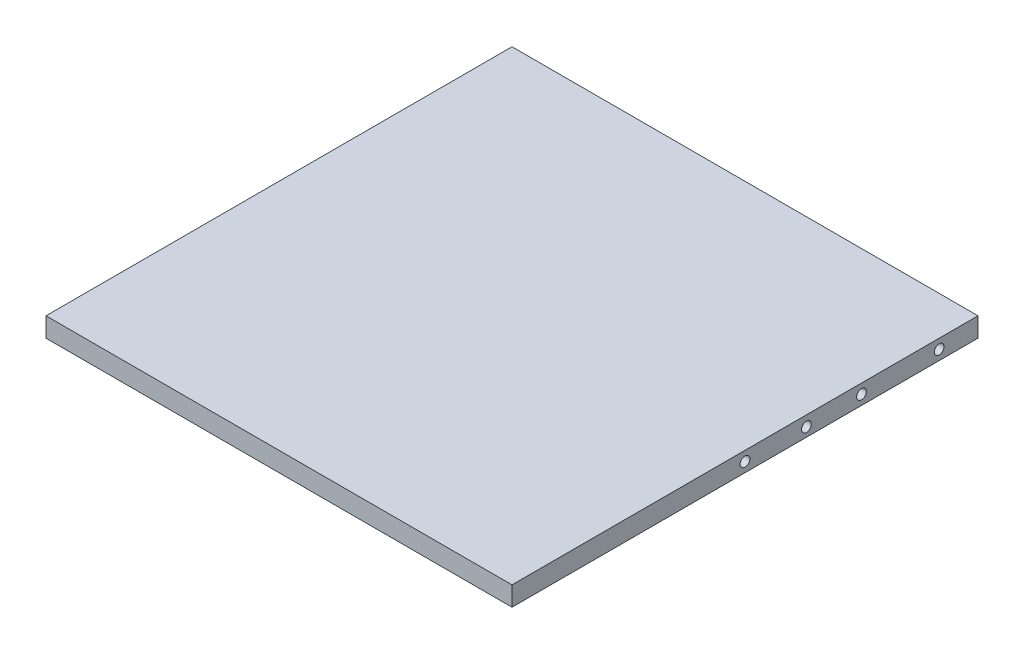
ISO-10303-21;
HEADER;
FILE_DESCRIPTION(('STEP AP214'),'2;1');
FILE_NAME('part.step','',(''),(''),'','','');
FILE_SCHEMA(('AUTOMOTIVE_DESIGN { 1 0 10303 214 1 1 1 1 }'));
ENDSEC;
DATA;
#1=APPLICATION_CONTEXT('core data for automotive mechanical design processes');
#2=APPLICATION_PROTOCOL_DEFINITION('international standard','automotive_design',2000,#1);
#3=PRODUCT_CONTEXT('',#1,'mechanical');
#4=PRODUCT('Part','Part','',(#3));
#5=PRODUCT_RELATED_PRODUCT_CATEGORY('part','',(#4));
#6=PRODUCT_DEFINITION_FORMATION('','',#4);
#7=PRODUCT_DEFINITION_CONTEXT('part definition',#1,'design');
#8=PRODUCT_DEFINITION('design','',#6,#7);
#9=PRODUCT_DEFINITION_SHAPE('','',#8);
#10=(LENGTH_UNIT() NAMED_UNIT(*) SI_UNIT(.MILLI.,.METRE.));
#11=(NAMED_UNIT(*) PLANE_ANGLE_UNIT() SI_UNIT($,.RADIAN.));
#12=(NAMED_UNIT(*) SI_UNIT($,.STERADIAN.) SOLID_ANGLE_UNIT());
#13=UNCERTAINTY_MEASURE_WITH_UNIT(LENGTH_MEASURE(1.E-05),#10,'distance_accuracy_value','');
#14=(GEOMETRIC_REPRESENTATION_CONTEXT(3) GLOBAL_UNCERTAINTY_ASSIGNED_CONTEXT((#13)) GLOBAL_UNIT_ASSIGNED_CONTEXT((#10,
#11,#12)) REPRESENTATION_CONTEXT('',''));
#15=CARTESIAN_POINT('',(0.,0.,0.));
#16=DIRECTION('',(0.,0.,1.));
#17=DIRECTION('',(1.,0.,0.));
#18=AXIS2_PLACEMENT_3D('',#15,#16,#17);
#19=CARTESIAN_POINT('',(-326.932011443915,15.8730731898551,-232.181384116071));
#20=DIRECTION('',(1.,0.,0.));
#21=DIRECTION('',(0.,0.,-1.));
#22=AXIS2_PLACEMENT_3D('',#19,#20,#21);
#23=PLANE('',#22);
#24=CARTESIAN_POINT('',(-326.932011443915,6.3480731898551,-194.081384116071));
#25=DIRECTION('',(1.,0.,0.));
#26=DIRECTION('',(0.,0.,-1.));
#27=AXIS2_PLACEMENT_3D('',#24,#25,#26);
#28=CIRCLE('',#27,4.7625);
#29=CARTESIAN_POINT('',(-326.932011443915,6.3480731898551,-189.318884116071));
#30=VERTEX_POINT('',#29);
#31=EDGE_CURVE('E130',#30,#30,#28,.T.);
#32=ORIENTED_EDGE('',*,*,#31,.T.);
#33=EDGE_LOOP('',(#32));
#34=FACE_BOUND('',#33,.T.);
#35=CARTESIAN_POINT('',(-326.932011443915,6.3480731898551,-117.881384116071));
#36=DIRECTION('',(1.,0.,0.));
#37=DIRECTION('',(0.,0.,-1.));
#38=AXIS2_PLACEMENT_3D('',#35,#36,#37);
#39=CIRCLE('',#38,4.7625);
#40=CARTESIAN_POINT('',(-326.932011443915,6.3480731898551,-113.118884116071));
#41=VERTEX_POINT('',#40);
#42=EDGE_CURVE('E122',#41,#41,#39,.T.);
#43=ORIENTED_EDGE('',*,*,#42,.T.);
#44=EDGE_LOOP('',(#43));
#45=FACE_BOUND('',#44,.T.);
#46=CARTESIAN_POINT('',(-326.932011443915,5.66464714054725,-63.8424058943178));
#47=DIRECTION('',(-1.,0.,0.));
#48=DIRECTION('',(0.,0.,1.));
#49=AXIS2_PLACEMENT_3D('',#46,#47,#48);
#50=CIRCLE('',#49,4.7625);
#51=CARTESIAN_POINT('',(-326.932011443915,5.66464714054725,-59.0799058943178));
#52=VERTEX_POINT('',#51);
#53=EDGE_CURVE('E119',#52,#52,#50,.T.);
#54=ORIENTED_EDGE('',*,*,#53,.F.);
#55=EDGE_LOOP('',(#54));
#56=FACE_BOUND('',#55,.T.);
#57=CARTESIAN_POINT('',(-326.932011443915,6.3480731898551,-3.58138411607117));
#58=DIRECTION('',(1.,0.,0.));
#59=DIRECTION('',(0.,0.,-1.));
#60=AXIS2_PLACEMENT_3D('',#57,#58,#59);
#61=CIRCLE('',#60,4.7625);
#62=CARTESIAN_POINT('',(-326.932011443915,6.3480731898551,-8.34388411607117));
#63=VERTEX_POINT('',#62);
#64=EDGE_CURVE('E102',#63,#63,#61,.T.);
#65=ORIENTED_EDGE('',*,*,#64,.T.);
#66=EDGE_LOOP('',(#65));
#67=FACE_BOUND('',#66,.T.);
#68=DIRECTION('',(0.,0.,1.));
#69=VECTOR('',#68,1.);
#70=CARTESIAN_POINT('',(-326.932011443915,-3.1769268101449,-232.181384116071));
#71=LINE('',#70,#69);
#72=CARTESIAN_POINT('',(-326.932011443915,-3.1769268101449,-232.181384116071));
#73=VERTEX_POINT('',#72);
#74=CARTESIAN_POINT('',(-326.932011443915,-3.1769268101449,225.018615883929));
#75=VERTEX_POINT('',#74);
#76=EDGE_CURVE('E99',#73,#75,#71,.T.);
#77=ORIENTED_EDGE('',*,*,#76,.T.);
#78=DIRECTION('',(0.,-1.,0.));
#79=VECTOR('',#78,1.);
#80=CARTESIAN_POINT('',(-326.932011443915,15.8730731898551,225.018615883929));
#81=LINE('',#80,#79);
#82=CARTESIAN_POINT('',(-326.932011443915,15.8730731898551,225.018615883929));
#83=VERTEX_POINT('',#82);
#84=EDGE_CURVE('E11',#83,#75,#81,.T.);
#85=ORIENTED_EDGE('',*,*,#84,.F.);
#86=DIRECTION('',(0.,0.,1.));
#87=VECTOR('',#86,1.);
#88=CARTESIAN_POINT('',(-326.932011443915,15.8730731898551,-232.181384116071));
#89=LINE('',#88,#87);
#90=CARTESIAN_POINT('',(-326.932011443915,15.8730731898551,-232.181384116071));
#91=VERTEX_POINT('',#90);
#92=EDGE_CURVE('E87',#91,#83,#89,.T.);
#93=ORIENTED_EDGE('',*,*,#92,.F.);
#94=DIRECTION('',(0.,-1.,0.));
#95=VECTOR('',#94,1.);
#96=CARTESIAN_POINT('',(-326.932011443915,15.8730731898551,-232.181384116071));
#97=LINE('',#96,#95);
#98=EDGE_CURVE('E95',#91,#73,#97,.T.);
#99=ORIENTED_EDGE('',*,*,#98,.T.);
#100=EDGE_LOOP('',(#77,#85,#93,#99));
#101=FACE_BOUND('',#100,.T.);
#102=ADVANCED_FACE('F36',(#34,#45,#56,#67,#101),#23,.F.);
#103=CARTESIAN_POINT('',(-326.932011443915,15.8730731898551,225.018615883929));
#104=DIRECTION('',(0.,0.,-1.));
#105=DIRECTION('',(-1.,0.,0.));
#106=AXIS2_PLACEMENT_3D('',#103,#104,#105);
#107=PLANE('',#106);
#108=DIRECTION('',(1.,0.,0.));
#109=VECTOR('',#108,1.);
#110=CARTESIAN_POINT('',(-326.932011443915,-3.1769268101449,225.018615883929));
#111=LINE('',#110,#109);
#112=CARTESIAN_POINT('',(130.267988556085,-3.1769268101449,225.018615883929));
#113=VERTEX_POINT('',#112);
#114=EDGE_CURVE('E91',#75,#113,#111,.T.);
#115=ORIENTED_EDGE('',*,*,#114,.T.);
#116=DIRECTION('',(0.,-1.,0.));
#117=VECTOR('',#116,1.);
#118=CARTESIAN_POINT('',(130.267988556085,15.8730731898551,225.018615883929));
#119=LINE('',#118,#117);
#120=CARTESIAN_POINT('',(130.267988556085,15.8730731898551,225.018615883929));
#121=VERTEX_POINT('',#120);
#122=EDGE_CURVE('E44',#121,#113,#119,.T.);
#123=ORIENTED_EDGE('',*,*,#122,.F.);
#124=DIRECTION('',(1.,0.,0.));
#125=VECTOR('',#124,1.);
#126=CARTESIAN_POINT('',(-326.932011443915,15.8730731898551,225.018615883929));
#127=LINE('',#126,#125);
#128=EDGE_CURVE('E82',#83,#121,#127,.T.);
#129=ORIENTED_EDGE('',*,*,#128,.F.);
#130=ORIENTED_EDGE('',*,*,#84,.T.);
#131=EDGE_LOOP('',(#115,#123,#129,#130));
#132=FACE_BOUND('',#131,.T.);
#133=ADVANCED_FACE('F90',(#132),#107,.F.);
#134=CARTESIAN_POINT('',(130.267988556085,15.8730731898551,-232.181384116071));
#135=DIRECTION('',(-1.,0.,0.));
#136=DIRECTION('',(0.,0.,1.));
#137=AXIS2_PLACEMENT_3D('',#134,#135,#136);
#138=PLANE('',#137);
#139=CARTESIAN_POINT('',(130.267988556085,6.3480731898551,-194.081384116071));
#140=DIRECTION('',(-1.,0.,0.));
#141=DIRECTION('',(0.,0.,1.));
#142=AXIS2_PLACEMENT_3D('',#139,#140,#141);
#143=CIRCLE('',#142,4.7625);
#144=CARTESIAN_POINT('',(130.267988556085,6.3480731898551,-189.318884116071));
#145=VERTEX_POINT('',#144);
#146=EDGE_CURVE('E133',#145,#145,#143,.T.);
#147=ORIENTED_EDGE('',*,*,#146,.T.);
#148=EDGE_LOOP('',(#147));
#149=FACE_BOUND('',#148,.T.);
#150=CARTESIAN_POINT('',(130.267988556085,6.3480731898551,-117.881384116071));
#151=DIRECTION('',(-1.,0.,0.));
#152=DIRECTION('',(0.,0.,1.));
#153=AXIS2_PLACEMENT_3D('',#150,#151,#152);
#154=CIRCLE('',#153,4.7625);
#155=CARTESIAN_POINT('',(130.267988556085,6.3480731898551,-113.118884116071));
#156=VERTEX_POINT('',#155);
#157=EDGE_CURVE('E127',#156,#156,#154,.T.);
#158=ORIENTED_EDGE('',*,*,#157,.T.);
#159=EDGE_LOOP('',(#158));
#160=FACE_BOUND('',#159,.T.);
#161=CARTESIAN_POINT('',(130.267988556085,5.66464714054725,-63.8424058943178));
#162=DIRECTION('',(-1.,0.,0.));
#163=DIRECTION('',(0.,0.,1.));
#164=AXIS2_PLACEMENT_3D('',#161,#162,#163);
#165=CIRCLE('',#164,4.7625);
#166=CARTESIAN_POINT('',(130.267988556085,5.66464714054725,-59.0799058943178));
#167=VERTEX_POINT('',#166);
#168=EDGE_CURVE('E116',#167,#167,#165,.T.);
#169=ORIENTED_EDGE('',*,*,#168,.T.);
#170=EDGE_LOOP('',(#169));
#171=FACE_BOUND('',#170,.T.);
#172=CARTESIAN_POINT('',(130.267988556085,6.3480731898551,-3.58138411607117));
#173=DIRECTION('',(1.,0.,0.));
#174=DIRECTION('',(0.,0.,-1.));
#175=AXIS2_PLACEMENT_3D('',#172,#173,#174);
#176=CIRCLE('',#175,4.7625);
#177=CARTESIAN_POINT('',(130.267988556085,6.3480731898551,-8.34388411607117));
#178=VERTEX_POINT('',#177);
#179=EDGE_CURVE('E113',#178,#178,#176,.T.);
#180=ORIENTED_EDGE('',*,*,#179,.F.);
#181=EDGE_LOOP('',(#180));
#182=FACE_BOUND('',#181,.T.);
#183=DIRECTION('',(0.,0.,-1.));
#184=VECTOR('',#183,1.);
#185=CARTESIAN_POINT('',(130.267988556085,-3.1769268101449,-232.181384116071));
#186=LINE('',#185,#184);
#187=CARTESIAN_POINT('',(130.267988556085,-3.1769268101449,-232.181384116071));
#188=VERTEX_POINT('',#187);
#189=EDGE_CURVE('E69',#113,#188,#186,.T.);
#190=ORIENTED_EDGE('',*,*,#189,.T.);
#191=DIRECTION('',(0.,-1.,0.));
#192=VECTOR('',#191,1.);
#193=CARTESIAN_POINT('',(130.267988556085,15.8730731898551,-232.181384116071));
#194=LINE('',#193,#192);
#195=CARTESIAN_POINT('',(130.267988556085,15.8730731898551,-232.181384116071));
#196=VERTEX_POINT('',#195);
#197=EDGE_CURVE('E92',#196,#188,#194,.T.);
#198=ORIENTED_EDGE('',*,*,#197,.F.);
#199=DIRECTION('',(0.,0.,-1.));
#200=VECTOR('',#199,1.);
#201=CARTESIAN_POINT('',(130.267988556085,15.8730731898551,-232.181384116071));
#202=LINE('',#201,#200);
#203=EDGE_CURVE('E85',#121,#196,#202,.T.);
#204=ORIENTED_EDGE('',*,*,#203,.F.);
#205=ORIENTED_EDGE('',*,*,#122,.T.);
#206=EDGE_LOOP('',(#190,#198,#204,#205));
#207=FACE_BOUND('',#206,.T.);
#208=ADVANCED_FACE('F93',(#149,#160,#171,#182,#207),#138,.F.);
#209=CARTESIAN_POINT('',(-326.932011443915,15.8730731898551,-232.181384116071));
#210=DIRECTION('',(0.,0.,1.));
#211=DIRECTION('',(1.,0.,0.));
#212=AXIS2_PLACEMENT_3D('',#209,#210,#211);
#213=PLANE('',#212);
#214=DIRECTION('',(-1.,0.,0.));
#215=VECTOR('',#214,1.);
#216=CARTESIAN_POINT('',(-326.932011443915,-3.1769268101449,-232.181384116071));
#217=LINE('',#216,#215);
#218=EDGE_CURVE('E75',#188,#73,#217,.T.);
#219=ORIENTED_EDGE('',*,*,#218,.T.);
#220=ORIENTED_EDGE('',*,*,#98,.F.);
#221=DIRECTION('',(-1.,0.,0.));
#222=VECTOR('',#221,1.);
#223=CARTESIAN_POINT('',(-326.932011443915,15.8730731898551,-232.181384116071));
#224=LINE('',#223,#222);
#225=EDGE_CURVE('E52',#196,#91,#224,.T.);
#226=ORIENTED_EDGE('',*,*,#225,.F.);
#227=ORIENTED_EDGE('',*,*,#197,.T.);
#228=EDGE_LOOP('',(#219,#220,#226,#227));
#229=FACE_BOUND('',#228,.T.);
#230=ADVANCED_FACE('F107',(#229),#213,.F.);
#231=CARTESIAN_POINT('',(49.1660057219576,15.8730731898551,0.246845549000511));
#232=DIRECTION('',(0.,1.,0.));
#233=DIRECTION('',(0.,0.,1.));
#234=AXIS2_PLACEMENT_3D('',#231,#232,#233);
#235=PLANE('',#234);
#236=ORIENTED_EDGE('',*,*,#92,.T.);
#237=ORIENTED_EDGE('',*,*,#128,.T.);
#238=ORIENTED_EDGE('',*,*,#203,.T.);
#239=ORIENTED_EDGE('',*,*,#225,.T.);
#240=EDGE_LOOP('',(#236,#237,#238,#239));
#241=FACE_BOUND('',#240,.T.);
#242=ADVANCED_FACE('F83',(#241),#235,.T.);
#243=CARTESIAN_POINT('',(49.1660057219576,-3.1769268101449,0.246845549000511));
#244=DIRECTION('',(0.,1.,0.));
#245=DIRECTION('',(0.,0.,1.));
#246=AXIS2_PLACEMENT_3D('',#243,#244,#245);
#247=PLANE('',#246);
#248=ORIENTED_EDGE('',*,*,#76,.F.);
#249=ORIENTED_EDGE('',*,*,#218,.F.);
#250=ORIENTED_EDGE('',*,*,#189,.F.);
#251=ORIENTED_EDGE('',*,*,#114,.F.);
#252=EDGE_LOOP('',(#248,#249,#250,#251));
#253=FACE_BOUND('',#252,.T.);
#254=ADVANCED_FACE('F110',(#253),#247,.F.);
#255=CARTESIAN_POINT('',(-326.932011443915,6.3480731898551,-3.58138411607117));
#256=DIRECTION('',(1.,0.,0.));
#257=DIRECTION('',(0.,0.,-1.));
#258=AXIS2_PLACEMENT_3D('',#255,#256,#257);
#259=CYLINDRICAL_SURFACE('',#258,4.7625);
#260=ORIENTED_EDGE('',*,*,#64,.F.);
#261=EDGE_LOOP('',(#260));
#262=FACE_BOUND('',#261,.T.);
#263=ORIENTED_EDGE('',*,*,#179,.T.);
#264=EDGE_LOOP('',(#263));
#265=FACE_BOUND('',#264,.T.);
#266=ADVANCED_FACE('F154',(#262,#265),#259,.F.);
#267=CARTESIAN_POINT('',(130.267988556085,5.66464714054725,-63.8424058943178));
#268=DIRECTION('',(-1.,0.,0.));
#269=DIRECTION('',(0.,0.,1.));
#270=AXIS2_PLACEMENT_3D('',#267,#268,#269);
#271=CYLINDRICAL_SURFACE('',#270,4.7625);
#272=CARTESIAN_POINT('',(130.267988556085,5.66464714054725,-59.0799058943178));
#273=CARTESIAN_POINT('',(125.505488556085,5.66464714054725,-59.0799058943178));
#274=CARTESIAN_POINT('',(120.742988556085,5.66464714054725,-59.0799058943178));
#275=CARTESIAN_POINT('',(111.217988556085,5.66464714054725,-59.0799058943178));
#276=CARTESIAN_POINT('',(106.455488556085,5.66464714054725,-59.0799058943178));
#277=CARTESIAN_POINT('',(96.9304885560848,5.66464714054725,-59.0799058943178));
#278=CARTESIAN_POINT('',(92.1679885560848,5.66464714054725,-59.0799058943178));
#279=CARTESIAN_POINT('',(82.6429885560848,5.66464714054725,-59.0799058943178));
#280=CARTESIAN_POINT('',(77.8804885560848,5.66464714054725,-59.0799058943178));
#281=CARTESIAN_POINT('',(68.3554885560848,5.66464714054725,-59.0799058943178));
#282=CARTESIAN_POINT('',(63.5929885560848,5.66464714054725,-59.0799058943178));
#283=CARTESIAN_POINT('',(54.0679885560848,5.66464714054725,-59.0799058943178));
#284=CARTESIAN_POINT('',(49.3054885560848,5.66464714054725,-59.0799058943178));
#285=CARTESIAN_POINT('',(39.7804885560848,5.66464714054725,-59.0799058943178));
#286=CARTESIAN_POINT('',(35.0179885560848,5.66464714054725,-59.0799058943178));
#287=CARTESIAN_POINT('',(25.4929885560848,5.66464714054725,-59.0799058943178));
#288=CARTESIAN_POINT('',(20.7304885560848,5.66464714054725,-59.0799058943178));
#289=CARTESIAN_POINT('',(11.2054885560848,5.66464714054725,-59.0799058943178));
#290=CARTESIAN_POINT('',(6.44298855608477,5.66464714054725,-59.0799058943178));
#291=CARTESIAN_POINT('',(-3.08201144391523,5.66464714054725,-59.0799058943178));
#292=CARTESIAN_POINT('',(-7.84451144391524,5.66464714054725,-59.0799058943178));
#293=CARTESIAN_POINT('',(-17.3695114439152,5.66464714054725,-59.0799058943178));
#294=CARTESIAN_POINT('',(-22.1320114439152,5.66464714054725,-59.0799058943178));
#295=CARTESIAN_POINT('',(-31.6570114439152,5.66464714054725,-59.0799058943178));
#296=CARTESIAN_POINT('',(-36.4195114439152,5.66464714054725,-59.0799058943178));
#297=CARTESIAN_POINT('',(-45.9445114439152,5.66464714054725,-59.0799058943178));
#298=CARTESIAN_POINT('',(-50.7070114439152,5.66464714054725,-59.0799058943178));
#299=CARTESIAN_POINT('',(-60.2320114439152,5.66464714054725,-59.0799058943178));
#300=CARTESIAN_POINT('',(-64.9945114439152,5.66464714054725,-59.0799058943178));
#301=CARTESIAN_POINT('',(-74.5195114439152,5.66464714054725,-59.0799058943178));
#302=CARTESIAN_POINT('',(-79.2820114439152,5.66464714054725,-59.0799058943178));
#303=CARTESIAN_POINT('',(-88.8070114439152,5.66464714054725,-59.0799058943178));
#304=CARTESIAN_POINT('',(-93.5695114439152,5.66464714054725,-59.0799058943178));
#305=CARTESIAN_POINT('',(-103.094511443915,5.66464714054725,-59.0799058943178));
#306=CARTESIAN_POINT('',(-107.857011443915,5.66464714054725,-59.0799058943178));
#307=CARTESIAN_POINT('',(-117.382011443915,5.66464714054725,-59.0799058943178));
#308=CARTESIAN_POINT('',(-122.144511443915,5.66464714054725,-59.0799058943178));
#309=CARTESIAN_POINT('',(-131.669511443915,5.66464714054725,-59.0799058943178));
#310=CARTESIAN_POINT('',(-136.432011443915,5.66464714054725,-59.0799058943178));
#311=CARTESIAN_POINT('',(-145.957011443915,5.66464714054725,-59.0799058943178));
#312=CARTESIAN_POINT('',(-150.719511443915,5.66464714054725,-59.0799058943178));
#313=CARTESIAN_POINT('',(-160.244511443915,5.66464714054725,-59.0799058943178));
#314=CARTESIAN_POINT('',(-165.007011443915,5.66464714054725,-59.0799058943178));
#315=CARTESIAN_POINT('',(-174.532011443915,5.66464714054725,-59.0799058943178));
#316=CARTESIAN_POINT('',(-179.294511443915,5.66464714054725,-59.0799058943178));
#317=CARTESIAN_POINT('',(-188.819511443915,5.66464714054725,-59.0799058943178));
#318=CARTESIAN_POINT('',(-193.582011443915,5.66464714054725,-59.0799058943178));
#319=CARTESIAN_POINT('',(-203.107011443915,5.66464714054725,-59.0799058943178));
#320=CARTESIAN_POINT('',(-207.869511443915,5.66464714054725,-59.0799058943178));
#321=CARTESIAN_POINT('',(-217.394511443915,5.66464714054725,-59.0799058943178));
#322=CARTESIAN_POINT('',(-222.157011443915,5.66464714054725,-59.0799058943178));
#323=CARTESIAN_POINT('',(-231.682011443915,5.66464714054725,-59.0799058943178));
#324=CARTESIAN_POINT('',(-236.444511443915,5.66464714054725,-59.0799058943178));
#325=CARTESIAN_POINT('',(-245.969511443915,5.66464714054725,-59.0799058943178));
#326=CARTESIAN_POINT('',(-250.732011443915,5.66464714054725,-59.0799058943178));
#327=CARTESIAN_POINT('',(-260.257011443915,5.66464714054725,-59.0799058943178));
#328=CARTESIAN_POINT('',(-265.019511443915,5.66464714054725,-59.0799058943178));
#329=CARTESIAN_POINT('',(-274.544511443915,5.66464714054725,-59.0799058943178));
#330=CARTESIAN_POINT('',(-279.307011443915,5.66464714054725,-59.0799058943178));
#331=CARTESIAN_POINT('',(-288.832011443915,5.66464714054725,-59.0799058943178));
#332=CARTESIAN_POINT('',(-293.594511443915,5.66464714054725,-59.0799058943178));
#333=CARTESIAN_POINT('',(-303.119511443915,5.66464714054725,-59.0799058943178));
#334=CARTESIAN_POINT('',(-307.882011443915,5.66464714054725,-59.0799058943178));
#335=CARTESIAN_POINT('',(-317.407011443915,5.66464714054725,-59.0799058943178));
#336=CARTESIAN_POINT('',(-322.169511443915,5.66464714054725,-59.0799058943178));
#337=CARTESIAN_POINT('',(-326.932011443915,5.66464714054725,-59.0799058943178));
#338=B_SPLINE_CURVE_WITH_KNOTS('',3,(#272,#273,#274,#275,#276,#277,#278,#279,#280,#281,#282,
#283,#284,#285,#286,#287,#288,#289,#290,#291,#292,#293,#294,#295,#296,#297,#298,#299,#300,#301,
#302,#303,#304,#305,#306,#307,#308,#309,#310,#311,#312,#313,#314,#315,#316,#317,#318,#319,#320,
#321,#322,#323,#324,#325,#326,#327,#328,#329,#330,#331,#332,#333,#334,#335,#336,#337),
.UNSPECIFIED.,.F.,.F.,(4,2,2,2,2,2,2,2,2,2,2,2,2,2,2,2,2,2,2,2,2,2,2,2,2,2,2,2,2,2,2,2,4),(0.,
14.2875,28.575,42.8625,57.15,71.4375,85.725,100.0125,114.3,128.5875,142.875,157.1625,171.45,
185.7375,200.025,214.3125,228.6,242.8875,257.175,271.4625,285.75,300.0375,314.325,328.6125,
342.9,357.1875,371.475,385.7625,400.05,414.3375,428.625,442.9125,457.2),.UNSPECIFIED.);
#339=EDGE_CURVE('BSEAM157',#167,#52,#338,.T.);
#340=ORIENTED_EDGE('',*,*,#168,.F.);
#341=ORIENTED_EDGE('',*,*,#53,.T.);
#342=ORIENTED_EDGE('',*,*,#339,.T.);
#343=ORIENTED_EDGE('',*,*,#339,.F.);
#344=EDGE_LOOP('',(#340,#342,#341,#343));
#345=FACE_BOUND('',#344,.T.);
#346=ADVANCED_FACE('F157',(#345),#271,.F.);
#347=CARTESIAN_POINT('',(130.267988556085,6.3480731898551,-117.881384116071));
#348=DIRECTION('',(-1.,0.,0.));
#349=DIRECTION('',(0.,0.,1.));
#350=AXIS2_PLACEMENT_3D('',#347,#348,#349);
#351=CYLINDRICAL_SURFACE('',#350,4.7625);
#352=CARTESIAN_POINT('',(130.267988556085,6.3480731898551,-113.118884116071));
#353=CARTESIAN_POINT('',(125.505488556085,6.3480731898551,-113.118884116071));
#354=CARTESIAN_POINT('',(120.742988556085,6.3480731898551,-113.118884116071));
#355=CARTESIAN_POINT('',(111.217988556085,6.3480731898551,-113.118884116071));
#356=CARTESIAN_POINT('',(106.455488556085,6.3480731898551,-113.118884116071));
#357=CARTESIAN_POINT('',(96.9304885560848,6.3480731898551,-113.118884116071));
#358=CARTESIAN_POINT('',(92.1679885560848,6.3480731898551,-113.118884116071));
#359=CARTESIAN_POINT('',(82.6429885560848,6.3480731898551,-113.118884116071));
#360=CARTESIAN_POINT('',(77.8804885560848,6.3480731898551,-113.118884116071));
#361=CARTESIAN_POINT('',(68.3554885560848,6.3480731898551,-113.118884116071));
#362=CARTESIAN_POINT('',(63.5929885560848,6.3480731898551,-113.118884116071));
#363=CARTESIAN_POINT('',(54.0679885560848,6.3480731898551,-113.118884116071));
#364=CARTESIAN_POINT('',(49.3054885560848,6.3480731898551,-113.118884116071));
#365=CARTESIAN_POINT('',(39.7804885560848,6.3480731898551,-113.118884116071));
#366=CARTESIAN_POINT('',(35.0179885560848,6.3480731898551,-113.118884116071));
#367=CARTESIAN_POINT('',(25.4929885560848,6.3480731898551,-113.118884116071));
#368=CARTESIAN_POINT('',(20.7304885560848,6.3480731898551,-113.118884116071));
#369=CARTESIAN_POINT('',(11.2054885560847,6.3480731898551,-113.118884116071));
#370=CARTESIAN_POINT('',(6.44298855608475,6.3480731898551,-113.118884116071));
#371=CARTESIAN_POINT('',(-3.08201144391526,6.3480731898551,-113.118884116071));
#372=CARTESIAN_POINT('',(-7.84451144391526,6.3480731898551,-113.118884116071));
#373=CARTESIAN_POINT('',(-17.3695114439153,6.3480731898551,-113.118884116071));
#374=CARTESIAN_POINT('',(-22.1320114439153,6.3480731898551,-113.118884116071));
#375=CARTESIAN_POINT('',(-31.6570114439153,6.3480731898551,-113.118884116071));
#376=CARTESIAN_POINT('',(-36.4195114439153,6.3480731898551,-113.118884116071));
#377=CARTESIAN_POINT('',(-45.9445114439153,6.3480731898551,-113.118884116071));
#378=CARTESIAN_POINT('',(-50.7070114439153,6.3480731898551,-113.118884116071));
#379=CARTESIAN_POINT('',(-60.2320114439153,6.3480731898551,-113.118884116071));
#380=CARTESIAN_POINT('',(-64.9945114439153,6.3480731898551,-113.118884116071));
#381=CARTESIAN_POINT('',(-74.5195114439153,6.3480731898551,-113.118884116071));
#382=CARTESIAN_POINT('',(-79.2820114439153,6.3480731898551,-113.118884116071));
#383=CARTESIAN_POINT('',(-88.8070114439153,6.3480731898551,-113.118884116071));
#384=CARTESIAN_POINT('',(-93.5695114439153,6.3480731898551,-113.118884116071));
#385=CARTESIAN_POINT('',(-103.094511443915,6.3480731898551,-113.118884116071));
#386=CARTESIAN_POINT('',(-107.857011443915,6.3480731898551,-113.118884116071));
#387=CARTESIAN_POINT('',(-117.382011443915,6.3480731898551,-113.118884116071));
#388=CARTESIAN_POINT('',(-122.144511443915,6.3480731898551,-113.118884116071));
#389=CARTESIAN_POINT('',(-131.669511443915,6.3480731898551,-113.118884116071));
#390=CARTESIAN_POINT('',(-136.432011443915,6.3480731898551,-113.118884116071));
#391=CARTESIAN_POINT('',(-145.957011443915,6.3480731898551,-113.118884116071));
#392=CARTESIAN_POINT('',(-150.719511443915,6.3480731898551,-113.118884116071));
#393=CARTESIAN_POINT('',(-160.244511443915,6.3480731898551,-113.118884116071));
#394=CARTESIAN_POINT('',(-165.007011443915,6.3480731898551,-113.118884116071));
#395=CARTESIAN_POINT('',(-174.532011443915,6.3480731898551,-113.118884116071));
#396=CARTESIAN_POINT('',(-179.294511443915,6.3480731898551,-113.118884116071));
#397=CARTESIAN_POINT('',(-188.819511443915,6.3480731898551,-113.118884116071));
#398=CARTESIAN_POINT('',(-193.582011443915,6.3480731898551,-113.118884116071));
#399=CARTESIAN_POINT('',(-203.107011443915,6.3480731898551,-113.118884116071));
#400=CARTESIAN_POINT('',(-207.869511443915,6.3480731898551,-113.118884116071));
#401=CARTESIAN_POINT('',(-217.394511443915,6.3480731898551,-113.118884116071));
#402=CARTESIAN_POINT('',(-222.157011443915,6.3480731898551,-113.118884116071));
#403=CARTESIAN_POINT('',(-231.682011443915,6.3480731898551,-113.118884116071));
#404=CARTESIAN_POINT('',(-236.444511443915,6.3480731898551,-113.118884116071));
#405=CARTESIAN_POINT('',(-245.969511443915,6.3480731898551,-113.118884116071));
#406=CARTESIAN_POINT('',(-250.732011443915,6.3480731898551,-113.118884116071));
#407=CARTESIAN_POINT('',(-260.257011443915,6.3480731898551,-113.118884116071));
#408=CARTESIAN_POINT('',(-265.019511443915,6.3480731898551,-113.118884116071));
#409=CARTESIAN_POINT('',(-274.544511443915,6.3480731898551,-113.118884116071));
#410=CARTESIAN_POINT('',(-279.307011443915,6.3480731898551,-113.118884116071));
#411=CARTESIAN_POINT('',(-288.832011443915,6.3480731898551,-113.118884116071));
#412=CARTESIAN_POINT('',(-293.594511443915,6.3480731898551,-113.118884116071));
#413=CARTESIAN_POINT('',(-303.119511443915,6.3480731898551,-113.118884116071));
#414=CARTESIAN_POINT('',(-307.882011443915,6.3480731898551,-113.118884116071));
#415=CARTESIAN_POINT('',(-317.407011443915,6.3480731898551,-113.118884116071));
#416=CARTESIAN_POINT('',(-322.169511443915,6.3480731898551,-113.118884116071));
#417=CARTESIAN_POINT('',(-326.932011443915,6.3480731898551,-113.118884116071));
#418=B_SPLINE_CURVE_WITH_KNOTS('',3,(#352,#353,#354,#355,#356,#357,#358,#359,#360,#361,#362,
#363,#364,#365,#366,#367,#368,#369,#370,#371,#372,#373,#374,#375,#376,#377,#378,#379,#380,#381,
#382,#383,#384,#385,#386,#387,#388,#389,#390,#391,#392,#393,#394,#395,#396,#397,#398,#399,#400,
#401,#402,#403,#404,#405,#406,#407,#408,#409,#410,#411,#412,#413,#414,#415,#416,#417),
.UNSPECIFIED.,.F.,.F.,(4,2,2,2,2,2,2,2,2,2,2,2,2,2,2,2,2,2,2,2,2,2,2,2,2,2,2,2,2,2,2,2,4),(0.,
14.2875,28.575,42.8625,57.15,71.4375,85.725,100.0125,114.3,128.5875,142.875,157.1625,171.45,
185.7375,200.025,214.3125,228.6,242.8875,257.175,271.4625,285.75,300.0375,314.325,328.6125,
342.9,357.1875,371.475,385.7625,400.05,414.3375,428.625,442.9125,457.2),.UNSPECIFIED.);
#419=EDGE_CURVE('BSEAM142',#156,#41,#418,.T.);
#420=ORIENTED_EDGE('',*,*,#157,.F.);
#421=ORIENTED_EDGE('',*,*,#42,.F.);
#422=ORIENTED_EDGE('',*,*,#419,.T.);
#423=ORIENTED_EDGE('',*,*,#419,.F.);
#424=EDGE_LOOP('',(#420,#422,#421,#423));
#425=FACE_BOUND('',#424,.T.);
#426=ADVANCED_FACE('F142',(#425),#351,.F.);
#427=CARTESIAN_POINT('',(130.267988556085,6.3480731898551,-194.081384116071));
#428=DIRECTION('',(-1.,0.,0.));
#429=DIRECTION('',(0.,0.,1.));
#430=AXIS2_PLACEMENT_3D('',#427,#428,#429);
#431=CYLINDRICAL_SURFACE('',#430,4.7625);
#432=CARTESIAN_POINT('',(130.267988556085,6.3480731898551,-189.318884116071));
#433=CARTESIAN_POINT('',(125.505488556085,6.3480731898551,-189.318884116071));
#434=CARTESIAN_POINT('',(120.742988556085,6.3480731898551,-189.318884116071));
#435=CARTESIAN_POINT('',(111.217988556085,6.3480731898551,-189.318884116071));
#436=CARTESIAN_POINT('',(106.455488556085,6.3480731898551,-189.318884116071));
#437=CARTESIAN_POINT('',(96.9304885560848,6.3480731898551,-189.318884116071));
#438=CARTESIAN_POINT('',(92.1679885560848,6.3480731898551,-189.318884116071));
#439=CARTESIAN_POINT('',(82.6429885560848,6.3480731898551,-189.318884116071));
#440=CARTESIAN_POINT('',(77.8804885560848,6.3480731898551,-189.318884116071));
#441=CARTESIAN_POINT('',(68.3554885560848,6.3480731898551,-189.318884116071));
#442=CARTESIAN_POINT('',(63.5929885560848,6.3480731898551,-189.318884116071));
#443=CARTESIAN_POINT('',(54.0679885560848,6.3480731898551,-189.318884116071));
#444=CARTESIAN_POINT('',(49.3054885560848,6.3480731898551,-189.318884116071));
#445=CARTESIAN_POINT('',(39.7804885560848,6.3480731898551,-189.318884116071));
#446=CARTESIAN_POINT('',(35.0179885560848,6.3480731898551,-189.318884116071));
#447=CARTESIAN_POINT('',(25.4929885560848,6.3480731898551,-189.318884116071));
#448=CARTESIAN_POINT('',(20.7304885560848,6.3480731898551,-189.318884116071));
#449=CARTESIAN_POINT('',(11.2054885560847,6.3480731898551,-189.318884116071));
#450=CARTESIAN_POINT('',(6.44298855608475,6.3480731898551,-189.318884116071));
#451=CARTESIAN_POINT('',(-3.08201144391526,6.3480731898551,-189.318884116071));
#452=CARTESIAN_POINT('',(-7.84451144391526,6.3480731898551,-189.318884116071));
#453=CARTESIAN_POINT('',(-17.3695114439153,6.3480731898551,-189.318884116071));
#454=CARTESIAN_POINT('',(-22.1320114439153,6.3480731898551,-189.318884116071));
#455=CARTESIAN_POINT('',(-31.6570114439153,6.3480731898551,-189.318884116071));
#456=CARTESIAN_POINT('',(-36.4195114439153,6.3480731898551,-189.318884116071));
#457=CARTESIAN_POINT('',(-45.9445114439153,6.3480731898551,-189.318884116071));
#458=CARTESIAN_POINT('',(-50.7070114439153,6.3480731898551,-189.318884116071));
#459=CARTESIAN_POINT('',(-60.2320114439153,6.3480731898551,-189.318884116071));
#460=CARTESIAN_POINT('',(-64.9945114439153,6.3480731898551,-189.318884116071));
#461=CARTESIAN_POINT('',(-74.5195114439153,6.3480731898551,-189.318884116071));
#462=CARTESIAN_POINT('',(-79.2820114439153,6.3480731898551,-189.318884116071));
#463=CARTESIAN_POINT('',(-88.8070114439153,6.3480731898551,-189.318884116071));
#464=CARTESIAN_POINT('',(-93.5695114439153,6.3480731898551,-189.318884116071));
#465=CARTESIAN_POINT('',(-103.094511443915,6.3480731898551,-189.318884116071));
#466=CARTESIAN_POINT('',(-107.857011443915,6.3480731898551,-189.318884116071));
#467=CARTESIAN_POINT('',(-117.382011443915,6.3480731898551,-189.318884116071));
#468=CARTESIAN_POINT('',(-122.144511443915,6.3480731898551,-189.318884116071));
#469=CARTESIAN_POINT('',(-131.669511443915,6.3480731898551,-189.318884116071));
#470=CARTESIAN_POINT('',(-136.432011443915,6.3480731898551,-189.318884116071));
#471=CARTESIAN_POINT('',(-145.957011443915,6.3480731898551,-189.318884116071));
#472=CARTESIAN_POINT('',(-150.719511443915,6.3480731898551,-189.318884116071));
#473=CARTESIAN_POINT('',(-160.244511443915,6.3480731898551,-189.318884116071));
#474=CARTESIAN_POINT('',(-165.007011443915,6.3480731898551,-189.318884116071));
#475=CARTESIAN_POINT('',(-174.532011443915,6.3480731898551,-189.318884116071));
#476=CARTESIAN_POINT('',(-179.294511443915,6.3480731898551,-189.318884116071));
#477=CARTESIAN_POINT('',(-188.819511443915,6.3480731898551,-189.318884116071));
#478=CARTESIAN_POINT('',(-193.582011443915,6.3480731898551,-189.318884116071));
#479=CARTESIAN_POINT('',(-203.107011443915,6.3480731898551,-189.318884116071));
#480=CARTESIAN_POINT('',(-207.869511443915,6.3480731898551,-189.318884116071));
#481=CARTESIAN_POINT('',(-217.394511443915,6.3480731898551,-189.318884116071));
#482=CARTESIAN_POINT('',(-222.157011443915,6.3480731898551,-189.318884116071));
#483=CARTESIAN_POINT('',(-231.682011443915,6.3480731898551,-189.318884116071));
#484=CARTESIAN_POINT('',(-236.444511443915,6.3480731898551,-189.318884116071));
#485=CARTESIAN_POINT('',(-245.969511443915,6.3480731898551,-189.318884116071));
#486=CARTESIAN_POINT('',(-250.732011443915,6.3480731898551,-189.318884116071));
#487=CARTESIAN_POINT('',(-260.257011443915,6.3480731898551,-189.318884116071));
#488=CARTESIAN_POINT('',(-265.019511443915,6.3480731898551,-189.318884116071));
#489=CARTESIAN_POINT('',(-274.544511443915,6.3480731898551,-189.318884116071));
#490=CARTESIAN_POINT('',(-279.307011443915,6.3480731898551,-189.318884116071));
#491=CARTESIAN_POINT('',(-288.832011443915,6.3480731898551,-189.318884116071));
#492=CARTESIAN_POINT('',(-293.594511443915,6.3480731898551,-189.318884116071));
#493=CARTESIAN_POINT('',(-303.119511443915,6.3480731898551,-189.318884116071));
#494=CARTESIAN_POINT('',(-307.882011443915,6.3480731898551,-189.318884116071));
#495=CARTESIAN_POINT('',(-317.407011443915,6.3480731898551,-189.318884116071));
#496=CARTESIAN_POINT('',(-322.169511443915,6.3480731898551,-189.318884116071));
#497=CARTESIAN_POINT('',(-326.932011443915,6.3480731898551,-189.318884116071));
#498=B_SPLINE_CURVE_WITH_KNOTS('',3,(#432,#433,#434,#435,#436,#437,#438,#439,#440,#441,#442,
#443,#444,#445,#446,#447,#448,#449,#450,#451,#452,#453,#454,#455,#456,#457,#458,#459,#460,#461,
#462,#463,#464,#465,#466,#467,#468,#469,#470,#471,#472,#473,#474,#475,#476,#477,#478,#479,#480,
#481,#482,#483,#484,#485,#486,#487,#488,#489,#490,#491,#492,#493,#494,#495,#496,#497),
.UNSPECIFIED.,.F.,.F.,(4,2,2,2,2,2,2,2,2,2,2,2,2,2,2,2,2,2,2,2,2,2,2,2,2,2,2,2,2,2,2,2,4),(0.,
14.2875,28.575,42.8625,57.15,71.4375,85.725,100.0125,114.3,128.5875,142.875,157.1625,171.45,
185.7375,200.025,214.3125,228.6,242.8875,257.175,271.4625,285.75,300.0375,314.325,328.6125,
342.9,357.1875,371.475,385.7625,400.05,414.3375,428.625,442.9125,457.2),.UNSPECIFIED.);
#499=EDGE_CURVE('BSEAM139',#145,#30,#498,.T.);
#500=ORIENTED_EDGE('',*,*,#146,.F.);
#501=ORIENTED_EDGE('',*,*,#31,.F.);
#502=ORIENTED_EDGE('',*,*,#499,.T.);
#503=ORIENTED_EDGE('',*,*,#499,.F.);
#504=EDGE_LOOP('',(#500,#502,#501,#503));
#505=FACE_BOUND('',#504,.T.);
#506=ADVANCED_FACE('F139',(#505),#431,.F.);
#507=CLOSED_SHELL('',(#102,#133,#208,#230,#242,#254,#266,#346,#426,#506));
#508=MANIFOLD_SOLID_BREP('B2',#507);
#509=ADVANCED_BREP_SHAPE_REPRESENTATION('',(#18,#508),#14);
#510=SHAPE_DEFINITION_REPRESENTATION(#9,#509);
ENDSEC;
END-ISO-10303-21;
